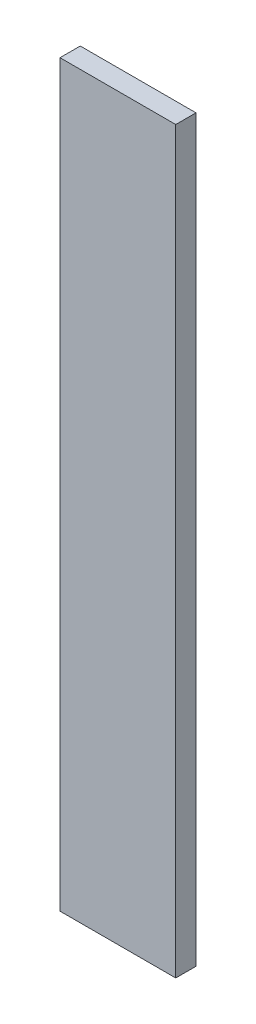
ISO-10303-21;
HEADER;
FILE_DESCRIPTION(('STEP AP214'),'2;1');
FILE_NAME('part.step','',(''),(''),'','','');
FILE_SCHEMA(('AUTOMOTIVE_DESIGN { 1 0 10303 214 1 1 1 1 }'));
ENDSEC;
DATA;
#1=APPLICATION_CONTEXT('core data for automotive mechanical design processes');
#2=APPLICATION_PROTOCOL_DEFINITION('international standard','automotive_design',2000,#1);
#3=PRODUCT_CONTEXT('',#1,'mechanical');
#4=PRODUCT('Part','Part','',(#3));
#5=PRODUCT_RELATED_PRODUCT_CATEGORY('part','',(#4));
#6=PRODUCT_DEFINITION_FORMATION('','',#4);
#7=PRODUCT_DEFINITION_CONTEXT('part definition',#1,'design');
#8=PRODUCT_DEFINITION('design','',#6,#7);
#9=PRODUCT_DEFINITION_SHAPE('','',#8);
#10=(LENGTH_UNIT() NAMED_UNIT(*) SI_UNIT(.MILLI.,.METRE.));
#11=(NAMED_UNIT(*) PLANE_ANGLE_UNIT() SI_UNIT($,.RADIAN.));
#12=(NAMED_UNIT(*) SI_UNIT($,.STERADIAN.) SOLID_ANGLE_UNIT());
#13=UNCERTAINTY_MEASURE_WITH_UNIT(LENGTH_MEASURE(1.E-05),#10,'distance_accuracy_value','');
#14=(GEOMETRIC_REPRESENTATION_CONTEXT(3) GLOBAL_UNCERTAINTY_ASSIGNED_CONTEXT((#13)) GLOBAL_UNIT_ASSIGNED_CONTEXT((#10,
#11,#12)) REPRESENTATION_CONTEXT('',''));
#15=CARTESIAN_POINT('',(0.,0.,0.));
#16=DIRECTION('',(0.,0.,1.));
#17=DIRECTION('',(1.,0.,0.));
#18=AXIS2_PLACEMENT_3D('',#15,#16,#17);
#19=CARTESIAN_POINT('',(0.,0.,0.05));
#20=DIRECTION('',(0.,0.,1.));
#21=DIRECTION('',(1.,0.,0.));
#22=AXIS2_PLACEMENT_3D('',#19,#20,#21);
#23=PLANE('',#22);
#24=DIRECTION('',(0.,1.,0.));
#25=VECTOR('',#24,1.);
#26=CARTESIAN_POINT('',(2.188972,-0.999236,0.05));
#27=LINE('',#26,#25);
#28=CARTESIAN_POINT('',(2.188972,0.825754,0.05));
#29=VERTEX_POINT('',#28);
#30=CARTESIAN_POINT('',(2.188972,-0.999236,0.05));
#31=VERTEX_POINT('',#30);
#32=EDGE_CURVE('E68',#29,#31,#27,.F.);
#33=ORIENTED_EDGE('',*,*,#32,.F.);
#34=DIRECTION('',(1.,0.,0.));
#35=VECTOR('',#34,1.);
#36=CARTESIAN_POINT('',(2.188972,0.825754,0.05));
#37=LINE('',#36,#35);
#38=CARTESIAN_POINT('',(1.903222,0.825754,0.05));
#39=VERTEX_POINT('',#38);
#40=EDGE_CURVE('E20',#39,#29,#37,.T.);
#41=ORIENTED_EDGE('',*,*,#40,.F.);
#42=DIRECTION('',(0.,1.,0.));
#43=VECTOR('',#42,1.);
#44=CARTESIAN_POINT('',(1.903222,0.825754,0.05));
#45=LINE('',#44,#43);
#46=CARTESIAN_POINT('',(1.903222,-0.999236,0.05));
#47=VERTEX_POINT('',#46);
#48=EDGE_CURVE('E58',#47,#39,#45,.T.);
#49=ORIENTED_EDGE('',*,*,#48,.F.);
#50=DIRECTION('',(1.,0.,0.));
#51=VECTOR('',#50,1.);
#52=CARTESIAN_POINT('',(1.903222,-0.999236,0.05));
#53=LINE('',#52,#51);
#54=EDGE_CURVE('E53',#31,#47,#53,.F.);
#55=ORIENTED_EDGE('',*,*,#54,.F.);
#56=EDGE_LOOP('',(#33,#41,#49,#55));
#57=FACE_BOUND('',#56,.T.);
#58=ADVANCED_FACE('F17',(#57),#23,.T.);
#59=CARTESIAN_POINT('',(2.188972,0.825754,0.));
#60=DIRECTION('',(0.,1.,0.));
#61=DIRECTION('',(0.,0.,1.));
#62=AXIS2_PLACEMENT_3D('',#59,#60,#61);
#63=PLANE('',#62);
#64=DIRECTION('',(0.,0.,-1.));
#65=VECTOR('',#64,1.);
#66=CARTESIAN_POINT('',(2.188972,0.825754,0.));
#67=LINE('',#66,#65);
#68=CARTESIAN_POINT('',(2.188972,0.825754,0.));
#69=VERTEX_POINT('',#68);
#70=EDGE_CURVE('E79',#69,#29,#67,.F.);
#71=ORIENTED_EDGE('',*,*,#70,.F.);
#72=DIRECTION('',(1.,0.,0.));
#73=VECTOR('',#72,1.);
#74=CARTESIAN_POINT('',(0.,0.825754,0.));
#75=LINE('',#74,#73);
#76=CARTESIAN_POINT('',(1.903222,0.825754,0.));
#77=VERTEX_POINT('',#76);
#78=EDGE_CURVE('E74',#69,#77,#75,.F.);
#79=ORIENTED_EDGE('',*,*,#78,.T.);
#80=DIRECTION('',(0.,0.,1.));
#81=VECTOR('',#80,1.);
#82=CARTESIAN_POINT('',(1.903222,0.825754,0.));
#83=LINE('',#82,#81);
#84=EDGE_CURVE('E63',#39,#77,#83,.F.);
#85=ORIENTED_EDGE('',*,*,#84,.F.);
#86=ORIENTED_EDGE('',*,*,#40,.T.);
#87=EDGE_LOOP('',(#71,#79,#85,#86));
#88=FACE_BOUND('',#87,.T.);
#89=ADVANCED_FACE('F73',(#88),#63,.T.);
#90=CARTESIAN_POINT('',(1.903222,0.825754,0.));
#91=DIRECTION('',(-1.,0.,0.));
#92=DIRECTION('',(0.,0.,1.));
#93=AXIS2_PLACEMENT_3D('',#90,#91,#92);
#94=PLANE('',#93);
#95=ORIENTED_EDGE('',*,*,#84,.T.);
#96=DIRECTION('',(0.,1.,0.));
#97=VECTOR('',#96,1.);
#98=CARTESIAN_POINT('',(1.903222,0.,0.));
#99=LINE('',#98,#97);
#100=CARTESIAN_POINT('',(1.903222,-0.999236,0.));
#101=VERTEX_POINT('',#100);
#102=EDGE_CURVE('E84',#77,#101,#99,.F.);
#103=ORIENTED_EDGE('',*,*,#102,.T.);
#104=DIRECTION('',(0.,0.,-1.));
#105=VECTOR('',#104,1.);
#106=CARTESIAN_POINT('',(1.903222,-0.999236,0.));
#107=LINE('',#106,#105);
#108=EDGE_CURVE('E65',#47,#101,#107,.T.);
#109=ORIENTED_EDGE('',*,*,#108,.F.);
#110=ORIENTED_EDGE('',*,*,#48,.T.);
#111=EDGE_LOOP('',(#95,#103,#109,#110));
#112=FACE_BOUND('',#111,.T.);
#113=ADVANCED_FACE('F60',(#112),#94,.T.);
#114=CARTESIAN_POINT('',(1.903222,-0.999236,0.));
#115=DIRECTION('',(0.,-1.,0.));
#116=DIRECTION('',(0.,0.,-1.));
#117=AXIS2_PLACEMENT_3D('',#114,#115,#116);
#118=PLANE('',#117);
#119=ORIENTED_EDGE('',*,*,#108,.T.);
#120=DIRECTION('',(1.,0.,0.));
#121=VECTOR('',#120,1.);
#122=CARTESIAN_POINT('',(0.,-0.999236,0.));
#123=LINE('',#122,#121);
#124=CARTESIAN_POINT('',(2.188972,-0.999236,0.));
#125=VERTEX_POINT('',#124);
#126=EDGE_CURVE('E26',#101,#125,#123,.T.);
#127=ORIENTED_EDGE('',*,*,#126,.T.);
#128=DIRECTION('',(0.,0.,-1.));
#129=VECTOR('',#128,1.);
#130=CARTESIAN_POINT('',(2.188972,-0.999236,0.));
#131=LINE('',#130,#129);
#132=EDGE_CURVE('E34',#31,#125,#131,.T.);
#133=ORIENTED_EDGE('',*,*,#132,.F.);
#134=ORIENTED_EDGE('',*,*,#54,.T.);
#135=EDGE_LOOP('',(#119,#127,#133,#134));
#136=FACE_BOUND('',#135,.T.);
#137=ADVANCED_FACE('F88',(#136),#118,.T.);
#138=CARTESIAN_POINT('',(2.188972,-0.999236,0.));
#139=DIRECTION('',(1.,0.,0.));
#140=DIRECTION('',(0.,0.,-1.));
#141=AXIS2_PLACEMENT_3D('',#138,#139,#140);
#142=PLANE('',#141);
#143=ORIENTED_EDGE('',*,*,#132,.T.);
#144=DIRECTION('',(0.,1.,0.));
#145=VECTOR('',#144,1.);
#146=CARTESIAN_POINT('',(2.188972,0.,0.));
#147=LINE('',#146,#145);
#148=EDGE_CURVE('E11',#125,#69,#147,.T.);
#149=ORIENTED_EDGE('',*,*,#148,.T.);
#150=ORIENTED_EDGE('',*,*,#70,.T.);
#151=ORIENTED_EDGE('',*,*,#32,.T.);
#152=EDGE_LOOP('',(#143,#149,#150,#151));
#153=FACE_BOUND('',#152,.T.);
#154=ADVANCED_FACE('F91',(#153),#142,.T.);
#155=CARTESIAN_POINT('',(0.,0.,0.));
#156=DIRECTION('',(0.,0.,1.));
#157=DIRECTION('',(1.,0.,0.));
#158=AXIS2_PLACEMENT_3D('',#155,#156,#157);
#159=PLANE('',#158);
#160=ORIENTED_EDGE('',*,*,#126,.F.);
#161=ORIENTED_EDGE('',*,*,#102,.F.);
#162=ORIENTED_EDGE('',*,*,#78,.F.);
#163=ORIENTED_EDGE('',*,*,#148,.F.);
#164=EDGE_LOOP('',(#160,#161,#162,#163));
#165=FACE_BOUND('',#164,.T.);
#166=ADVANCED_FACE('F90',(#165),#159,.F.);
#167=CLOSED_SHELL('',(#58,#89,#113,#137,#154,#166));
#168=MANIFOLD_SOLID_BREP('B1',#167);
#169=ADVANCED_BREP_SHAPE_REPRESENTATION('',(#18,#168),#14);
#170=SHAPE_DEFINITION_REPRESENTATION(#9,#169);
ENDSEC;
END-ISO-10303-21;
